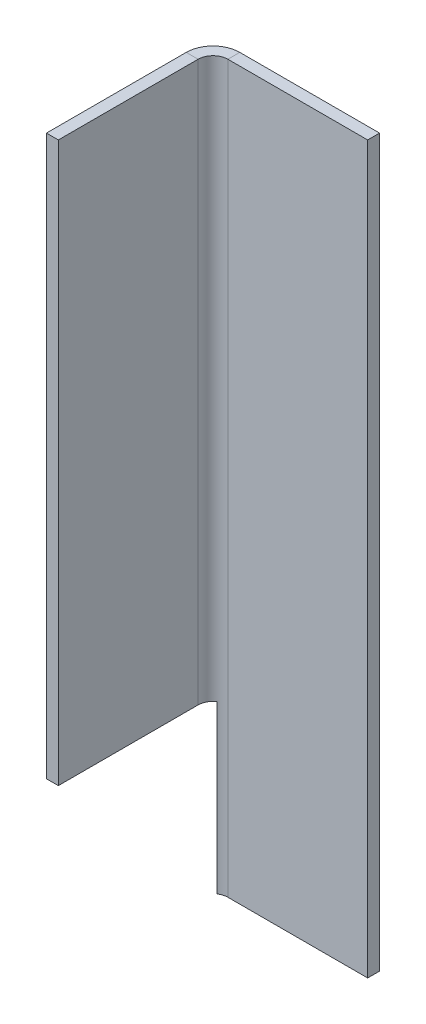
ISO-10303-21;
HEADER;
FILE_DESCRIPTION(('STEP AP214'),'2;1');
FILE_NAME('part.step','',(''),(''),'','','');
FILE_SCHEMA(('AUTOMOTIVE_DESIGN { 1 0 10303 214 1 1 1 1 }'));
ENDSEC;
DATA;
#1=APPLICATION_CONTEXT('core data for automotive mechanical design processes');
#2=APPLICATION_PROTOCOL_DEFINITION('international standard','automotive_design',2000,#1);
#3=PRODUCT_CONTEXT('',#1,'mechanical');
#4=PRODUCT('Part','Part','',(#3));
#5=PRODUCT_RELATED_PRODUCT_CATEGORY('part','',(#4));
#6=PRODUCT_DEFINITION_FORMATION('','',#4);
#7=PRODUCT_DEFINITION_CONTEXT('part definition',#1,'design');
#8=PRODUCT_DEFINITION('design','',#6,#7);
#9=PRODUCT_DEFINITION_SHAPE('','',#8);
#10=(LENGTH_UNIT() NAMED_UNIT(*) SI_UNIT(.MILLI.,.METRE.));
#11=(NAMED_UNIT(*) PLANE_ANGLE_UNIT() SI_UNIT($,.RADIAN.));
#12=(NAMED_UNIT(*) SI_UNIT($,.STERADIAN.) SOLID_ANGLE_UNIT());
#13=UNCERTAINTY_MEASURE_WITH_UNIT(LENGTH_MEASURE(1.E-05),#10,'distance_accuracy_value','');
#14=(GEOMETRIC_REPRESENTATION_CONTEXT(3) GLOBAL_UNCERTAINTY_ASSIGNED_CONTEXT((#13)) GLOBAL_UNIT_ASSIGNED_CONTEXT((#10,
#11,#12)) REPRESENTATION_CONTEXT('',''));
#15=CARTESIAN_POINT('',(0.,0.,0.));
#16=DIRECTION('',(0.,0.,1.));
#17=DIRECTION('',(1.,0.,0.));
#18=AXIS2_PLACEMENT_3D('',#15,#16,#17);
#19=CARTESIAN_POINT('',(-2.,0.,0.));
#20=DIRECTION('',(-1.,0.,0.));
#21=DIRECTION('',(0.,0.,1.));
#22=AXIS2_PLACEMENT_3D('',#19,#20,#21);
#23=PLANE('',#22);
#24=DIRECTION('',(0.,1.,0.));
#25=VECTOR('',#24,1.);
#26=CARTESIAN_POINT('',(-2.00000000000001,61.,-9.50000000000001));
#27=LINE('',#26,#25);
#28=CARTESIAN_POINT('',(-2.00000000000001,61.,-9.50000000000001));
#29=VERTEX_POINT('',#28);
#30=CARTESIAN_POINT('',(-2.00000000000001,-33.,-9.50000000000001));
#31=VERTEX_POINT('',#30);
#32=EDGE_CURVE('E179',#29,#31,#27,.F.);
#33=ORIENTED_EDGE('',*,*,#32,.T.);
#34=DIRECTION('',(0.,0.,1.));
#35=VECTOR('',#34,1.);
#36=CARTESIAN_POINT('',(-2.,-33.,2.24999999999999));
#37=LINE('',#36,#35);
#38=CARTESIAN_POINT('',(-2.,-33.,14.));
#39=VERTEX_POINT('',#38);
#40=EDGE_CURVE('E148',#39,#31,#37,.F.);
#41=ORIENTED_EDGE('',*,*,#40,.F.);
#42=DIRECTION('',(0.,-1.,0.));
#43=VECTOR('',#42,1.);
#44=CARTESIAN_POINT('',(-2.,-61.,14.));
#45=LINE('',#44,#43);
#46=CARTESIAN_POINT('',(-2.,61.,14.));
#47=VERTEX_POINT('',#46);
#48=EDGE_CURVE('E67',#47,#39,#45,.T.);
#49=ORIENTED_EDGE('',*,*,#48,.F.);
#50=DIRECTION('',(0.,0.,1.));
#51=VECTOR('',#50,1.);
#52=CARTESIAN_POINT('',(-2.,61.,14.));
#53=LINE('',#52,#51);
#54=EDGE_CURVE('E82',#29,#47,#53,.T.);
#55=ORIENTED_EDGE('',*,*,#54,.F.);
#56=EDGE_LOOP('',(#33,#41,#49,#55));
#57=FACE_BOUND('',#56,.T.);
#58=ADVANCED_FACE('F59',(#57),#23,.T.);
#59=CARTESIAN_POINT('',(0.,0.,0.));
#60=DIRECTION('',(-1.,0.,0.));
#61=DIRECTION('',(0.,0.,1.));
#62=AXIS2_PLACEMENT_3D('',#59,#60,#61);
#63=PLANE('',#62);
#64=DIRECTION('',(0.,0.,-1.));
#65=VECTOR('',#64,1.);
#66=CARTESIAN_POINT('',(0.,-33.,0.));
#67=LINE('',#66,#65);
#68=CARTESIAN_POINT('',(0.,-33.,14.));
#69=VERTEX_POINT('',#68);
#70=CARTESIAN_POINT('',(0.,-33.,-9.50000000000001));
#71=VERTEX_POINT('',#70);
#72=EDGE_CURVE('E137',#69,#71,#67,.T.);
#73=ORIENTED_EDGE('',*,*,#72,.T.);
#74=DIRECTION('',(0.,1.,0.));
#75=VECTOR('',#74,1.);
#76=CARTESIAN_POINT('',(0.,61.,-9.50000000000001));
#77=LINE('',#76,#75);
#78=CARTESIAN_POINT('',(0.,61.,-9.50000000000001));
#79=VERTEX_POINT('',#78);
#80=EDGE_CURVE('E171',#79,#71,#77,.F.);
#81=ORIENTED_EDGE('',*,*,#80,.F.);
#82=DIRECTION('',(0.,0.,1.));
#83=VECTOR('',#82,1.);
#84=CARTESIAN_POINT('',(0.,61.,14.));
#85=LINE('',#84,#83);
#86=CARTESIAN_POINT('',(0.,61.,14.));
#87=VERTEX_POINT('',#86);
#88=EDGE_CURVE('E160',#79,#87,#85,.T.);
#89=ORIENTED_EDGE('',*,*,#88,.T.);
#90=DIRECTION('',(0.,-1.,0.));
#91=VECTOR('',#90,1.);
#92=CARTESIAN_POINT('',(0.,-61.,14.));
#93=LINE('',#92,#91);
#94=EDGE_CURVE('E154',#87,#69,#93,.T.);
#95=ORIENTED_EDGE('',*,*,#94,.T.);
#96=EDGE_LOOP('',(#73,#81,#89,#95));
#97=FACE_BOUND('',#96,.T.);
#98=ADVANCED_FACE('F158',(#97),#63,.F.);
#99=CARTESIAN_POINT('',(-2.,-61.,14.));
#100=DIRECTION('',(0.,0.,1.));
#101=DIRECTION('',(1.,0.,0.));
#102=AXIS2_PLACEMENT_3D('',#99,#100,#101);
#103=PLANE('',#102);
#104=ORIENTED_EDGE('',*,*,#48,.T.);
#105=DIRECTION('',(-1.,0.,0.));
#106=VECTOR('',#105,1.);
#107=CARTESIAN_POINT('',(0.,-33.,14.));
#108=LINE('',#107,#106);
#109=EDGE_CURVE('E140',#39,#69,#108,.F.);
#110=ORIENTED_EDGE('',*,*,#109,.T.);
#111=ORIENTED_EDGE('',*,*,#94,.F.);
#112=DIRECTION('',(1.,0.,0.));
#113=VECTOR('',#112,1.);
#114=CARTESIAN_POINT('',(-2.,61.,14.));
#115=LINE('',#114,#113);
#116=EDGE_CURVE('E13',#47,#87,#115,.T.);
#117=ORIENTED_EDGE('',*,*,#116,.F.);
#118=EDGE_LOOP('',(#104,#110,#111,#117));
#119=FACE_BOUND('',#118,.T.);
#120=ADVANCED_FACE('F153',(#119),#103,.T.);
#121=CARTESIAN_POINT('',(2.49999999999999,-61.,-9.50000000000001));
#122=DIRECTION('',(0.,-1.,0.));
#123=DIRECTION('',(0.,0.,-1.));
#124=AXIS2_PLACEMENT_3D('',#121,#122,#123);
#125=PLANE('',#124);
#126=CARTESIAN_POINT('',(2.49999999999999,-61.,-9.50000000000001));
#127=DIRECTION('',(0.,1.,0.));
#128=DIRECTION('',(0.,0.,1.));
#129=AXIS2_PLACEMENT_3D('',#126,#127,#128);
#130=CIRCLE('',#129,2.5);
#131=CARTESIAN_POINT('',(1.11111111111111,-61.,-11.5786985482078));
#132=VERTEX_POINT('',#131);
#133=CARTESIAN_POINT('',(2.49999999999998,-61.,-12.));
#134=VERTEX_POINT('',#133);
#135=EDGE_CURVE('E174',#132,#134,#130,.F.);
#136=ORIENTED_EDGE('',*,*,#135,.F.);
#137=DIRECTION('',(-0.555555555555554,0.,-0.831479419283099));
#138=VECTOR('',#137,1.);
#139=CARTESIAN_POINT('',(0.,-61.,-13.241657386774));
#140=LINE('',#139,#138);
#141=CARTESIAN_POINT('',(0.,-61.,-13.241657386774));
#142=VERTEX_POINT('',#141);
#143=EDGE_CURVE('E74',#142,#132,#140,.F.);
#144=ORIENTED_EDGE('',*,*,#143,.F.);
#145=CARTESIAN_POINT('',(2.49999999999999,-61.,-9.50000000000001));
#146=DIRECTION('',(0.,1.,0.));
#147=DIRECTION('',(0.,0.,1.));
#148=AXIS2_PLACEMENT_3D('',#145,#146,#147);
#149=CIRCLE('',#148,4.5);
#150=CARTESIAN_POINT('',(2.49999999999998,-61.,-14.));
#151=VERTEX_POINT('',#150);
#152=EDGE_CURVE('E167',#142,#151,#149,.F.);
#153=ORIENTED_EDGE('',*,*,#152,.T.);
#154=DIRECTION('',(0.,0.,1.));
#155=VECTOR('',#154,1.);
#156=CARTESIAN_POINT('',(2.49999999999999,-61.,-14.));
#157=LINE('',#156,#155);
#158=EDGE_CURVE('E183',#134,#151,#157,.F.);
#159=ORIENTED_EDGE('',*,*,#158,.F.);
#160=EDGE_LOOP('',(#136,#144,#153,#159));
#161=FACE_BOUND('',#160,.T.);
#162=ADVANCED_FACE('F245',(#161),#125,.T.);
#163=CARTESIAN_POINT('',(2.49999999999999,61.,-9.50000000000001));
#164=DIRECTION('',(0.,1.,0.));
#165=DIRECTION('',(0.,0.,-1.));
#166=AXIS2_PLACEMENT_3D('',#163,#164,#165);
#167=CYLINDRICAL_SURFACE('',#166,4.5);
#168=DIRECTION('',(0.,1.,0.));
#169=VECTOR('',#168,1.);
#170=CARTESIAN_POINT('',(0.,61.,-13.241657386774));
#171=LINE('',#170,#169);
#172=CARTESIAN_POINT('',(0.,-33.,-13.241657386774));
#173=VERTEX_POINT('',#172);
#174=EDGE_CURVE('E219',#173,#142,#171,.F.);
#175=ORIENTED_EDGE('',*,*,#174,.F.);
#176=CARTESIAN_POINT('',(2.49999999999999,-33.,-9.50000000000001));
#177=DIRECTION('',(0.,1.,0.));
#178=DIRECTION('',(0.,0.,1.));
#179=AXIS2_PLACEMENT_3D('',#176,#177,#178);
#180=CIRCLE('',#179,4.5);
#181=EDGE_CURVE('E156',#31,#173,#180,.F.);
#182=ORIENTED_EDGE('',*,*,#181,.F.);
#183=ORIENTED_EDGE('',*,*,#32,.F.);
#184=CARTESIAN_POINT('',(2.49999999999999,61.,-9.50000000000001));
#185=DIRECTION('',(0.,1.,0.));
#186=DIRECTION('',(0.,0.,1.));
#187=AXIS2_PLACEMENT_3D('',#184,#185,#186);
#188=CIRCLE('',#187,4.5);
#189=CARTESIAN_POINT('',(2.49999999999999,61.,-14.));
#190=VERTEX_POINT('',#189);
#191=EDGE_CURVE('E176',#190,#29,#188,.T.);
#192=ORIENTED_EDGE('',*,*,#191,.F.);
#193=DIRECTION('',(0.,1.,0.));
#194=VECTOR('',#193,1.);
#195=CARTESIAN_POINT('',(2.49999999999999,-61.,-14.));
#196=LINE('',#195,#194);
#197=EDGE_CURVE('E191',#190,#151,#196,.F.);
#198=ORIENTED_EDGE('',*,*,#197,.T.);
#199=ORIENTED_EDGE('',*,*,#152,.F.);
#200=EDGE_LOOP('',(#175,#182,#183,#192,#198,#199));
#201=FACE_BOUND('',#200,.T.);
#202=ADVANCED_FACE('F233',(#201),#167,.T.);
#203=CARTESIAN_POINT('',(2.49999999999999,61.,-9.50000000000001));
#204=DIRECTION('',(0.,1.,0.));
#205=DIRECTION('',(0.,0.,-1.));
#206=AXIS2_PLACEMENT_3D('',#203,#204,#205);
#207=CYLINDRICAL_SURFACE('',#206,2.5);
#208=CARTESIAN_POINT('',(2.49999999999999,-33.,-9.50000000000001));
#209=DIRECTION('',(0.,1.,0.));
#210=DIRECTION('',(0.,0.,1.));
#211=AXIS2_PLACEMENT_3D('',#208,#209,#210);
#212=CIRCLE('',#211,2.5);
#213=CARTESIAN_POINT('',(1.11111111111111,-33.,-11.5786985482078));
#214=VERTEX_POINT('',#213);
#215=EDGE_CURVE('E221',#71,#214,#212,.F.);
#216=ORIENTED_EDGE('',*,*,#215,.T.);
#217=DIRECTION('',(0.,1.,0.));
#218=VECTOR('',#217,1.);
#219=CARTESIAN_POINT('',(1.11111111111111,61.,-11.5786985482078));
#220=LINE('',#219,#218);
#221=EDGE_CURVE('E216',#214,#132,#220,.F.);
#222=ORIENTED_EDGE('',*,*,#221,.T.);
#223=ORIENTED_EDGE('',*,*,#135,.T.);
#224=DIRECTION('',(0.,1.,0.));
#225=VECTOR('',#224,1.);
#226=CARTESIAN_POINT('',(2.49999999999999,-61.,-12.));
#227=LINE('',#226,#225);
#228=CARTESIAN_POINT('',(2.49999999999998,61.,-12.));
#229=VERTEX_POINT('',#228);
#230=EDGE_CURVE('E186',#134,#229,#227,.T.);
#231=ORIENTED_EDGE('',*,*,#230,.T.);
#232=CARTESIAN_POINT('',(2.49999999999999,61.,-9.50000000000001));
#233=DIRECTION('',(0.,1.,0.));
#234=DIRECTION('',(0.,0.,1.));
#235=AXIS2_PLACEMENT_3D('',#232,#233,#234);
#236=CIRCLE('',#235,2.5);
#237=EDGE_CURVE('E168',#229,#79,#236,.T.);
#238=ORIENTED_EDGE('',*,*,#237,.T.);
#239=ORIENTED_EDGE('',*,*,#80,.T.);
#240=EDGE_LOOP('',(#216,#222,#223,#231,#238,#239));
#241=FACE_BOUND('',#240,.T.);
#242=ADVANCED_FACE('F253',(#241),#207,.F.);
#243=CARTESIAN_POINT('',(-2.,61.,14.));
#244=DIRECTION('',(0.,1.,0.));
#245=DIRECTION('',(0.,0.,1.));
#246=AXIS2_PLACEMENT_3D('',#243,#244,#245);
#247=PLANE('',#246);
#248=ORIENTED_EDGE('',*,*,#88,.F.);
#249=DIRECTION('',(-1.,0.,0.));
#250=VECTOR('',#249,1.);
#251=CARTESIAN_POINT('',(0.,61.,-9.50000000000001));
#252=LINE('',#251,#250);
#253=EDGE_CURVE('E162',#79,#29,#252,.T.);
#254=ORIENTED_EDGE('',*,*,#253,.T.);
#255=ORIENTED_EDGE('',*,*,#54,.T.);
#256=ORIENTED_EDGE('',*,*,#116,.T.);
#257=EDGE_LOOP('',(#248,#254,#255,#256));
#258=FACE_BOUND('',#257,.T.);
#259=ADVANCED_FACE('F61',(#258),#247,.T.);
#260=CARTESIAN_POINT('',(2.49999999999999,61.,-9.50000000000001));
#261=DIRECTION('',(0.,-1.,0.));
#262=DIRECTION('',(0.,0.,-1.));
#263=AXIS2_PLACEMENT_3D('',#260,#261,#262);
#264=PLANE('',#263);
#265=ORIENTED_EDGE('',*,*,#237,.F.);
#266=DIRECTION('',(0.,0.,1.));
#267=VECTOR('',#266,1.);
#268=CARTESIAN_POINT('',(2.49999999999999,61.,-12.));
#269=LINE('',#268,#267);
#270=EDGE_CURVE('E188',#229,#190,#269,.F.);
#271=ORIENTED_EDGE('',*,*,#270,.T.);
#272=ORIENTED_EDGE('',*,*,#191,.T.);
#273=ORIENTED_EDGE('',*,*,#253,.F.);
#274=EDGE_LOOP('',(#265,#271,#272,#273));
#275=FACE_BOUND('',#274,.T.);
#276=ADVANCED_FACE('F242',(#275),#264,.F.);
#277=CARTESIAN_POINT('',(26.,61.,-14.0000000000001));
#278=DIRECTION('',(0.,-1.,0.));
#279=DIRECTION('',(0.,0.,-1.));
#280=AXIS2_PLACEMENT_3D('',#277,#278,#279);
#281=PLANE('',#280);
#282=ORIENTED_EDGE('',*,*,#270,.F.);
#283=DIRECTION('',(-1.,0.,0.));
#284=VECTOR('',#283,1.);
#285=CARTESIAN_POINT('',(26.,61.,-12.0000000000001));
#286=LINE('',#285,#284);
#287=CARTESIAN_POINT('',(26.,61.,-12.0000000000001));
#288=VERTEX_POINT('',#287);
#289=EDGE_CURVE('E194',#229,#288,#286,.F.);
#290=ORIENTED_EDGE('',*,*,#289,.T.);
#291=DIRECTION('',(0.,0.,1.));
#292=VECTOR('',#291,1.);
#293=CARTESIAN_POINT('',(26.,61.,-14.0000000000001));
#294=LINE('',#293,#292);
#295=CARTESIAN_POINT('',(26.,61.,-14.0000000000001));
#296=VERTEX_POINT('',#295);
#297=EDGE_CURVE('E172',#296,#288,#294,.T.);
#298=ORIENTED_EDGE('',*,*,#297,.F.);
#299=DIRECTION('',(1.,0.,0.));
#300=VECTOR('',#299,1.);
#301=CARTESIAN_POINT('',(0.,61.,-14.));
#302=LINE('',#301,#300);
#303=EDGE_CURVE('E201',#190,#296,#302,.T.);
#304=ORIENTED_EDGE('',*,*,#303,.F.);
#305=EDGE_LOOP('',(#282,#290,#298,#304));
#306=FACE_BOUND('',#305,.T.);
#307=ADVANCED_FACE('F260',(#306),#281,.F.);
#308=CARTESIAN_POINT('',(0.,-61.,-14.));
#309=DIRECTION('',(0.,1.,0.));
#310=DIRECTION('',(0.,0.,1.));
#311=AXIS2_PLACEMENT_3D('',#308,#309,#310);
#312=PLANE('',#311);
#313=ORIENTED_EDGE('',*,*,#158,.T.);
#314=DIRECTION('',(-1.,0.,0.));
#315=VECTOR('',#314,1.);
#316=CARTESIAN_POINT('',(0.,-61.,-14.));
#317=LINE('',#316,#315);
#318=CARTESIAN_POINT('',(26.,-61.,-14.0000000000001));
#319=VERTEX_POINT('',#318);
#320=EDGE_CURVE('E205',#319,#151,#317,.T.);
#321=ORIENTED_EDGE('',*,*,#320,.F.);
#322=DIRECTION('',(0.,0.,1.));
#323=VECTOR('',#322,1.);
#324=CARTESIAN_POINT('',(26.,-61.,-14.0000000000001));
#325=LINE('',#324,#323);
#326=CARTESIAN_POINT('',(26.,-61.,-12.0000000000001));
#327=VERTEX_POINT('',#326);
#328=EDGE_CURVE('E208',#319,#327,#325,.T.);
#329=ORIENTED_EDGE('',*,*,#328,.T.);
#330=DIRECTION('',(1.,0.,0.));
#331=VECTOR('',#330,1.);
#332=CARTESIAN_POINT('',(0.,-61.,-12.));
#333=LINE('',#332,#331);
#334=EDGE_CURVE('E198',#327,#134,#333,.F.);
#335=ORIENTED_EDGE('',*,*,#334,.T.);
#336=EDGE_LOOP('',(#313,#321,#329,#335));
#337=FACE_BOUND('',#336,.T.);
#338=ADVANCED_FACE('F263',(#337),#312,.F.);
#339=CARTESIAN_POINT('',(0.,0.,-14.));
#340=DIRECTION('',(0.,0.,1.));
#341=DIRECTION('',(1.,0.,0.));
#342=AXIS2_PLACEMENT_3D('',#339,#340,#341);
#343=PLANE('',#342);
#344=ORIENTED_EDGE('',*,*,#197,.F.);
#345=ORIENTED_EDGE('',*,*,#303,.T.);
#346=DIRECTION('',(0.,-1.,0.));
#347=VECTOR('',#346,1.);
#348=CARTESIAN_POINT('',(26.,0.,-14.0000000000001));
#349=LINE('',#348,#347);
#350=EDGE_CURVE('E203',#296,#319,#349,.T.);
#351=ORIENTED_EDGE('',*,*,#350,.T.);
#352=ORIENTED_EDGE('',*,*,#320,.T.);
#353=EDGE_LOOP('',(#344,#345,#351,#352));
#354=FACE_BOUND('',#353,.T.);
#355=ADVANCED_FACE('F272',(#354),#343,.F.);
#356=CARTESIAN_POINT('',(0.,0.,-12.));
#357=DIRECTION('',(0.,0.,1.));
#358=DIRECTION('',(1.,0.,0.));
#359=AXIS2_PLACEMENT_3D('',#356,#357,#358);
#360=PLANE('',#359);
#361=ORIENTED_EDGE('',*,*,#289,.F.);
#362=ORIENTED_EDGE('',*,*,#230,.F.);
#363=ORIENTED_EDGE('',*,*,#334,.F.);
#364=DIRECTION('',(0.,1.,0.));
#365=VECTOR('',#364,1.);
#366=CARTESIAN_POINT('',(26.,-61.,-12.0000000000001));
#367=LINE('',#366,#365);
#368=EDGE_CURVE('E196',#288,#327,#367,.F.);
#369=ORIENTED_EDGE('',*,*,#368,.F.);
#370=EDGE_LOOP('',(#361,#362,#363,#369));
#371=FACE_BOUND('',#370,.T.);
#372=ADVANCED_FACE('F268',(#371),#360,.T.);
#373=CARTESIAN_POINT('',(26.,-61.,-14.0000000000001));
#374=DIRECTION('',(-1.,0.,0.));
#375=DIRECTION('',(0.,0.,1.));
#376=AXIS2_PLACEMENT_3D('',#373,#374,#375);
#377=PLANE('',#376);
#378=ORIENTED_EDGE('',*,*,#368,.T.);
#379=ORIENTED_EDGE('',*,*,#328,.F.);
#380=ORIENTED_EDGE('',*,*,#350,.F.);
#381=ORIENTED_EDGE('',*,*,#297,.T.);
#382=EDGE_LOOP('',(#378,#379,#380,#381));
#383=FACE_BOUND('',#382,.T.);
#384=ADVANCED_FACE('F265',(#383),#377,.F.);
#385=CARTESIAN_POINT('',(2.49999999999999,-33.,-9.50000000000001));
#386=DIRECTION('',(0.,-1.,0.));
#387=DIRECTION('',(0.,0.,-1.));
#388=AXIS2_PLACEMENT_3D('',#385,#386,#387);
#389=PLANE('',#388);
#390=DIRECTION('',(-1.,0.,0.));
#391=VECTOR('',#390,1.);
#392=CARTESIAN_POINT('',(-2.00000000000001,-33.,-9.50000000000001));
#393=LINE('',#392,#391);
#394=EDGE_CURVE('E143',#31,#71,#393,.F.);
#395=ORIENTED_EDGE('',*,*,#394,.F.);
#396=ORIENTED_EDGE('',*,*,#181,.T.);
#397=DIRECTION('',(-0.555555555555554,0.,-0.831479419283099));
#398=VECTOR('',#397,1.);
#399=CARTESIAN_POINT('',(0.,-33.,-13.241657386774));
#400=LINE('',#399,#398);
#401=EDGE_CURVE('E213',#173,#214,#400,.F.);
#402=ORIENTED_EDGE('',*,*,#401,.T.);
#403=ORIENTED_EDGE('',*,*,#215,.F.);
#404=EDGE_LOOP('',(#395,#396,#402,#403));
#405=FACE_BOUND('',#404,.T.);
#406=ADVANCED_FACE('F229',(#405),#389,.T.);
#407=CARTESIAN_POINT('',(0.,-47.,-13.241657386774));
#408=DIRECTION('',(-0.831479419283099,0.,0.555555555555554));
#409=DIRECTION('',(0.,1.,0.));
#410=AXIS2_PLACEMENT_3D('',#407,#408,#409);
#411=PLANE('',#410);
#412=ORIENTED_EDGE('',*,*,#174,.T.);
#413=ORIENTED_EDGE('',*,*,#143,.T.);
#414=ORIENTED_EDGE('',*,*,#221,.F.);
#415=ORIENTED_EDGE('',*,*,#401,.F.);
#416=EDGE_LOOP('',(#412,#413,#414,#415));
#417=FACE_BOUND('',#416,.T.);
#418=ADVANCED_FACE('F280',(#417),#411,.T.);
#419=CARTESIAN_POINT('',(0.,-33.,0.));
#420=DIRECTION('',(0.,1.,0.));
#421=DIRECTION('',(0.,0.,-1.));
#422=AXIS2_PLACEMENT_3D('',#419,#420,#421);
#423=PLANE('',#422);
#424=ORIENTED_EDGE('',*,*,#109,.F.);
#425=ORIENTED_EDGE('',*,*,#40,.T.);
#426=ORIENTED_EDGE('',*,*,#394,.T.);
#427=ORIENTED_EDGE('',*,*,#72,.F.);
#428=EDGE_LOOP('',(#424,#425,#426,#427));
#429=FACE_BOUND('',#428,.T.);
#430=ADVANCED_FACE('F139',(#429),#423,.F.);
#431=CLOSED_SHELL('',(#58,#98,#120,#162,#202,#242,#259,#276,#307,#338,#355,#372,#384,#406,#418,#430));
#432=MANIFOLD_SOLID_BREP('B2',#431);
#433=ADVANCED_BREP_SHAPE_REPRESENTATION('',(#18,#432),#14);
#434=SHAPE_DEFINITION_REPRESENTATION(#9,#433);
ENDSEC;
END-ISO-10303-21;
